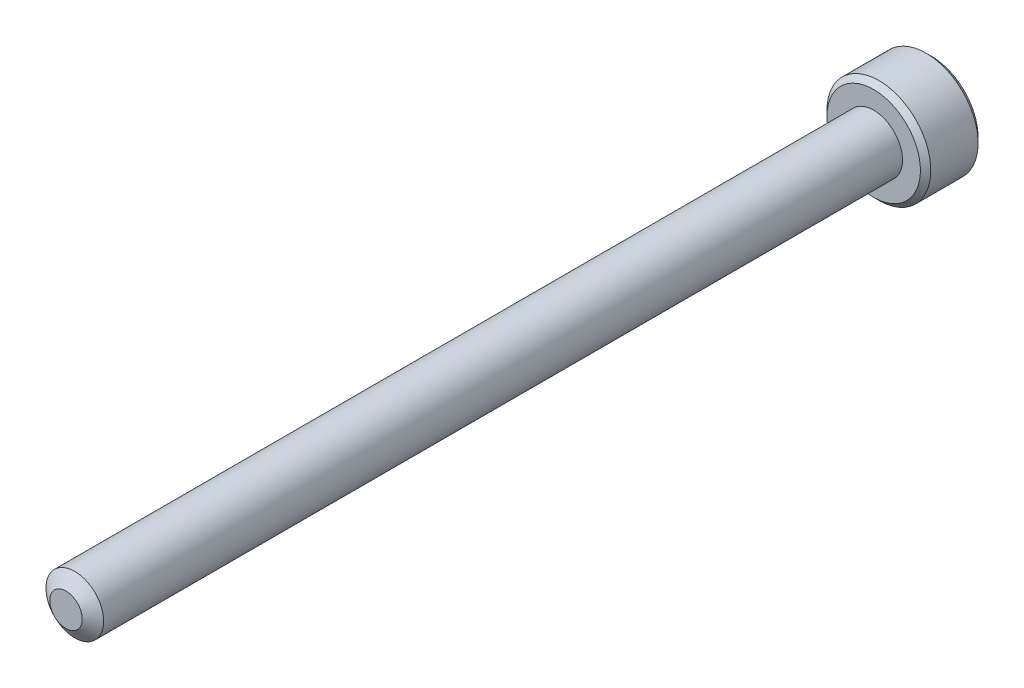
ISO-10303-21;
HEADER;
FILE_DESCRIPTION(('STEP AP214'),'2;1');
FILE_NAME('part.step','',(''),(''),'','','');
FILE_SCHEMA(('AUTOMOTIVE_DESIGN { 1 0 10303 214 1 1 1 1 }'));
ENDSEC;
DATA;
#1=APPLICATION_CONTEXT('core data for automotive mechanical design processes');
#2=APPLICATION_PROTOCOL_DEFINITION('international standard','automotive_design',2000,#1);
#3=PRODUCT_CONTEXT('',#1,'mechanical');
#4=PRODUCT('Part','Part','',(#3));
#5=PRODUCT_RELATED_PRODUCT_CATEGORY('part','',(#4));
#6=PRODUCT_DEFINITION_FORMATION('','',#4);
#7=PRODUCT_DEFINITION_CONTEXT('part definition',#1,'design');
#8=PRODUCT_DEFINITION('design','',#6,#7);
#9=PRODUCT_DEFINITION_SHAPE('','',#8);
#10=(LENGTH_UNIT() NAMED_UNIT(*) SI_UNIT(.MILLI.,.METRE.));
#11=(NAMED_UNIT(*) PLANE_ANGLE_UNIT() SI_UNIT($,.RADIAN.));
#12=(NAMED_UNIT(*) SI_UNIT($,.STERADIAN.) SOLID_ANGLE_UNIT());
#13=UNCERTAINTY_MEASURE_WITH_UNIT(LENGTH_MEASURE(1.E-05),#10,'distance_accuracy_value','');
#14=(GEOMETRIC_REPRESENTATION_CONTEXT(3) GLOBAL_UNCERTAINTY_ASSIGNED_CONTEXT((#13)) GLOBAL_UNIT_ASSIGNED_CONTEXT((#10,
#11,#12)) REPRESENTATION_CONTEXT('',''));
#15=CARTESIAN_POINT('',(0.,0.,0.));
#16=DIRECTION('',(0.,0.,1.));
#17=DIRECTION('',(1.,0.,0.));
#18=AXIS2_PLACEMENT_3D('',#15,#16,#17);
#19=CARTESIAN_POINT('',(0.,0.,-35.));
#20=DIRECTION('',(0.,0.,1.));
#21=DIRECTION('',(1.,0.,0.));
#22=AXIS2_PLACEMENT_3D('',#19,#20,#21);
#23=CYLINDRICAL_SURFACE('',#22,1.25);
#24=CARTESIAN_POINT('',(0.,0.,-35.));
#25=DIRECTION('',(0.,0.,-1.));
#26=DIRECTION('',(-1.,0.,0.));
#27=AXIS2_PLACEMENT_3D('',#24,#25,#26);
#28=CIRCLE('',#27,1.25);
#29=CARTESIAN_POINT('',(-1.25,0.,-35.));
#30=VERTEX_POINT('',#29);
#31=EDGE_CURVE('E220',#30,#30,#28,.F.);
#32=ORIENTED_EDGE('',*,*,#31,.T.);
#33=EDGE_LOOP('',(#32));
#34=FACE_BOUND('',#33,.T.);
#35=CARTESIAN_POINT('',(0.,0.,-0.382511876358969));
#36=DIRECTION('',(0.,0.,1.));
#37=DIRECTION('',(1.,0.,0.));
#38=AXIS2_PLACEMENT_3D('',#35,#36,#37);
#39=CIRCLE('',#38,1.25);
#40=CARTESIAN_POINT('',(1.25,0.,-0.382511876358969));
#41=VERTEX_POINT('',#40);
#42=EDGE_CURVE('E113',#41,#41,#39,.T.);
#43=ORIENTED_EDGE('',*,*,#42,.F.);
#44=EDGE_LOOP('',(#43));
#45=FACE_BOUND('',#44,.T.);
#46=ADVANCED_FACE('F39',(#34,#45),#23,.T.);
#47=CARTESIAN_POINT('',(0.,0.,0.));
#48=DIRECTION('',(0.,0.,-1.));
#49=DIRECTION('',(-1.,0.,0.));
#50=AXIS2_PLACEMENT_3D('',#47,#48,#49);
#51=CONICAL_SURFACE('',#50,0.70371642622275,0.959931088596884);
#52=ORIENTED_EDGE('',*,*,#42,.T.);
#53=EDGE_LOOP('',(#52));
#54=FACE_BOUND('',#53,.T.);
#55=CARTESIAN_POINT('',(0.,0.,0.));
#56=DIRECTION('',(0.,0.,1.));
#57=DIRECTION('',(1.,0.,0.));
#58=AXIS2_PLACEMENT_3D('',#55,#56,#57);
#59=CIRCLE('',#58,0.70371642622275);
#60=CARTESIAN_POINT('',(0.70371642622275,0.,0.));
#61=VERTEX_POINT('',#60);
#62=EDGE_CURVE('E218',#61,#61,#59,.T.);
#63=ORIENTED_EDGE('',*,*,#62,.F.);
#64=EDGE_LOOP('',(#63));
#65=FACE_BOUND('',#64,.T.);
#66=ADVANCED_FACE('F200',(#54,#65),#51,.T.);
#67=CARTESIAN_POINT('',(0.,0.,0.));
#68=DIRECTION('',(0.,0.,1.));
#69=DIRECTION('',(1.,0.,0.));
#70=AXIS2_PLACEMENT_3D('',#67,#68,#69);
#71=PLANE('',#70);
#72=ORIENTED_EDGE('',*,*,#62,.T.);
#73=EDGE_LOOP('',(#72));
#74=FACE_BOUND('',#73,.T.);
#75=ADVANCED_FACE('F197',(#74),#71,.T.);
#76=CARTESIAN_POINT('',(0.,0.,-37.5));
#77=DIRECTION('',(0.,0.,1.));
#78=DIRECTION('',(1.,0.,0.));
#79=AXIS2_PLACEMENT_3D('',#76,#77,#78);
#80=CYLINDRICAL_SURFACE('',#79,2.25);
#81=CARTESIAN_POINT('',(0.,0.,-37.275));
#82=DIRECTION('',(0.,0.,-1.));
#83=DIRECTION('',(-1.,0.,0.));
#84=AXIS2_PLACEMENT_3D('',#81,#82,#83);
#85=CIRCLE('',#84,2.25);
#86=CARTESIAN_POINT('',(-2.25,0.,-37.275));
#87=VERTEX_POINT('',#86);
#88=EDGE_CURVE('E47',#87,#87,#85,.F.);
#89=ORIENTED_EDGE('',*,*,#88,.T.);
#90=EDGE_LOOP('',(#89));
#91=FACE_BOUND('',#90,.T.);
#92=CARTESIAN_POINT('',(0.,0.,-35.225));
#93=DIRECTION('',(0.,0.,-1.));
#94=DIRECTION('',(-1.,0.,0.));
#95=AXIS2_PLACEMENT_3D('',#92,#93,#94);
#96=CIRCLE('',#95,2.25);
#97=CARTESIAN_POINT('',(-2.25,0.,-35.225));
#98=VERTEX_POINT('',#97);
#99=EDGE_CURVE('E176',#98,#98,#96,.T.);
#100=ORIENTED_EDGE('',*,*,#99,.T.);
#101=EDGE_LOOP('',(#100));
#102=FACE_BOUND('',#101,.T.);
#103=ADVANCED_FACE('F181',(#91,#102),#80,.T.);
#104=CARTESIAN_POINT('',(0.,0.,-37.5));
#105=DIRECTION('',(0.,0.,-1.));
#106=DIRECTION('',(-1.,0.,0.));
#107=AXIS2_PLACEMENT_3D('',#104,#105,#106);
#108=PLANE('',#107);
#109=CARTESIAN_POINT('',(0.,0.,-37.5));
#110=DIRECTION('',(0.,0.,-1.));
#111=DIRECTION('',(-1.,0.,0.));
#112=AXIS2_PLACEMENT_3D('',#109,#110,#111);
#113=CIRCLE('',#112,2.025);
#114=CARTESIAN_POINT('',(-2.025,0.,-37.5));
#115=VERTEX_POINT('',#114);
#116=EDGE_CURVE('E112',#115,#115,#113,.T.);
#117=ORIENTED_EDGE('',*,*,#116,.T.);
#118=EDGE_LOOP('',(#117));
#119=FACE_BOUND('',#118,.T.);
#120=CARTESIAN_POINT('',(0.,0.,-37.5));
#121=DIRECTION('',(0.,0.,-1.));
#122=DIRECTION('',(-1.,0.,0.));
#123=AXIS2_PLACEMENT_3D('',#120,#121,#122);
#124=CIRCLE('',#123,1.15470053837925);
#125=CARTESIAN_POINT('',(-0.999999999999999,0.577350269189627,-37.5));
#126=VERTEX_POINT('',#125);
#127=CARTESIAN_POINT('',(0.,1.15470053837925,-37.5));
#128=VERTEX_POINT('',#127);
#129=EDGE_CURVE('E93',#126,#128,#124,.T.);
#130=ORIENTED_EDGE('',*,*,#129,.F.);
#131=CARTESIAN_POINT('',(-1.,-0.577350269189626,-37.5));
#132=VERTEX_POINT('',#131);
#133=EDGE_CURVE('E53',#132,#126,#124,.T.);
#134=ORIENTED_EDGE('',*,*,#133,.F.);
#135=CARTESIAN_POINT('',(0.,-1.15470053837925,-37.5));
#136=VERTEX_POINT('',#135);
#137=EDGE_CURVE('E279',#136,#132,#124,.T.);
#138=ORIENTED_EDGE('',*,*,#137,.F.);
#139=CARTESIAN_POINT('',(1.,-0.577350269189627,-37.5));
#140=VERTEX_POINT('',#139);
#141=EDGE_CURVE('E60',#140,#136,#124,.T.);
#142=ORIENTED_EDGE('',*,*,#141,.F.);
#143=CARTESIAN_POINT('',(1.,0.577350269189626,-37.5));
#144=VERTEX_POINT('',#143);
#145=EDGE_CURVE('E134',#144,#140,#124,.T.);
#146=ORIENTED_EDGE('',*,*,#145,.F.);
#147=EDGE_CURVE('E102',#128,#144,#124,.T.);
#148=ORIENTED_EDGE('',*,*,#147,.F.);
#149=EDGE_LOOP('',(#130,#134,#138,#142,#146,#148));
#150=FACE_BOUND('',#149,.T.);
#151=ADVANCED_FACE('F133',(#119,#150),#108,.T.);
#152=CARTESIAN_POINT('',(0.,0.,-35.));
#153=DIRECTION('',(0.,0.,-1.));
#154=DIRECTION('',(-1.,0.,0.));
#155=AXIS2_PLACEMENT_3D('',#152,#153,#154);
#156=PLANE('',#155);
#157=CARTESIAN_POINT('',(0.,0.,-35.));
#158=DIRECTION('',(0.,0.,-1.));
#159=DIRECTION('',(-1.,0.,0.));
#160=AXIS2_PLACEMENT_3D('',#157,#158,#159);
#161=CIRCLE('',#160,2.025);
#162=CARTESIAN_POINT('',(-2.025,0.,-35.));
#163=VERTEX_POINT('',#162);
#164=EDGE_CURVE('E11',#163,#163,#161,.F.);
#165=ORIENTED_EDGE('',*,*,#164,.T.);
#166=EDGE_LOOP('',(#165));
#167=FACE_BOUND('',#166,.T.);
#168=ORIENTED_EDGE('',*,*,#31,.F.);
#169=EDGE_LOOP('',(#168));
#170=FACE_BOUND('',#169,.T.);
#171=ADVANCED_FACE('F190',(#167,#170),#156,.F.);
#172=CARTESIAN_POINT('',(0.,0.,-37.5));
#173=DIRECTION('',(0.,0.,-1.));
#174=DIRECTION('',(-1.,0.,0.));
#175=AXIS2_PLACEMENT_3D('',#172,#173,#174);
#176=CONICAL_SURFACE('',#175,1.15470053837925,0.78539816339745);
#177=ORIENTED_EDGE('',*,*,#147,.T.);
#178=CARTESIAN_POINT('',(-0.000200000000000379,1.15481600843309,-37.5001154873726));
#179=CARTESIAN_POINT('',(0.0341825950071801,1.13496520795026,-37.4802779308257));
#180=CARTESIAN_POINT('',(0.0691401181398246,1.11478247255942,-37.4616050206389));
#181=CARTESIAN_POINT('',(0.140422802956091,1.07362739529219,-37.4274147427232));
#182=CARTESIAN_POINT('',(0.176754750528987,1.0526511355808,-37.4119164090235));
#183=CARTESIAN_POINT('',(0.250016613803317,1.01035337909803,-37.3853673071423));
#184=CARTESIAN_POINT('',(0.286927851445421,0.989042666109237,-37.3742497739969));
#185=CARTESIAN_POINT('',(0.361562729310866,0.945952199282687,-37.3571198657762));
#186=CARTESIAN_POINT('',(0.399284088108643,0.924173762626593,-37.3510946974667));
#187=CARTESIAN_POINT('',(0.464292198417941,0.886641312640011,-37.3456605549675));
#188=CARTESIAN_POINT('',(0.491494371528179,0.870936130672271,-37.3448569383167));
#189=CARTESIAN_POINT('',(0.54584604066912,0.839556179862844,-37.3462066994169));
#190=CARTESIAN_POINT('',(0.572995523754883,0.823881418494919,-37.3483607295472));
#191=CARTESIAN_POINT('',(0.654056277326968,0.777080970599362,-37.3591169721285));
#192=CARTESIAN_POINT('',(0.707564140978436,0.746188191116425,-37.3720145564154));
#193=CARTESIAN_POINT('',(0.801476065143439,0.691968116419645,-37.4031407306022));
#194=CARTESIAN_POINT('',(0.84232052367184,0.668386557293369,-37.4197377977018));
#195=CARTESIAN_POINT('',(0.922409637381945,0.62214708593368,-37.4571249246853));
#196=CARTESIAN_POINT('',(0.961659010870438,0.599486449584575,-37.4779013418174));
#197=CARTESIAN_POINT('',(1.0002,0.577234799135788,-37.5001154873726));
#198=B_SPLINE_CURVE_WITH_KNOTS('',3,(#178,#179,#180,#181,#182,#183,#184,#185,#186,#187,#188,
#189,#190,#191,#192,#193,#194,#195,#196,#197),.UNSPECIFIED.,.F.,.F.,(4,2,2,2,2,2,2,2,2,4),(0.,
0.13323767682856,0.267252229834496,0.39913707626931,0.530689603280778,0.624814864263856,
0.718960890149144,0.907306626112109,1.0571010036179,1.20641411519286),.UNSPECIFIED.);
#199=EDGE_CURVE('E107',#128,#144,#198,.T.);
#200=ORIENTED_EDGE('',*,*,#199,.F.);
#201=EDGE_LOOP('',(#177,#200));
#202=FACE_BOUND('',#201,.T.);
#203=ADVANCED_FACE('F108',(#202),#176,.F.);
#204=ORIENTED_EDGE('',*,*,#145,.T.);
#205=CARTESIAN_POINT('',(1.,-1.15147208646462,-37.8703856775139));
#206=CARTESIAN_POINT('',(1.,-1.12343447988552,-37.8492199198737));
#207=CARTESIAN_POINT('',(1.,-1.09524064850697,-37.8282616921759));
#208=CARTESIAN_POINT('',(1.,-1.03847715644376,-37.7868460222356));
#209=CARTESIAN_POINT('',(1.,-1.00990740382975,-37.7663887061237));
#210=CARTESIAN_POINT('',(1.,-0.923120894333473,-37.7056047949545));
#211=CARTESIAN_POINT('',(1.,-0.864253173759057,-37.6661922289614));
#212=CARTESIAN_POINT('',(1.,-0.740809858258044,-37.5888206642002));
#213=CARTESIAN_POINT('',(1.,-0.676100255137806,-37.5510730391143));
#214=CARTESIAN_POINT('',(1.,-0.543448939049123,-37.4820245875513));
#215=CARTESIAN_POINT('',(1.,-0.475519112027777,-37.4507020278469));
#216=CARTESIAN_POINT('',(1.,-0.373555850333527,-37.4123817788838));
#217=CARTESIAN_POINT('',(1.,-0.341031989670906,-37.4013835916422));
#218=CARTESIAN_POINT('',(1.,-0.275199079052292,-37.3819983421474));
#219=CARTESIAN_POINT('',(1.,-0.241889975173932,-37.3736114597767));
#220=CARTESIAN_POINT('',(1.,-0.175247517042993,-37.360025220719));
#221=CARTESIAN_POINT('',(1.,-0.141925568218175,-37.354770790768));
#222=CARTESIAN_POINT('',(1.,-0.0749144362322789,-37.3475486865709));
#223=CARTESIAN_POINT('',(1.,-0.0412251978501619,-37.3455815136105));
#224=CARTESIAN_POINT('',(1.,0.0249580992634206,-37.3450831983932));
#225=CARTESIAN_POINT('',(1.,0.0574512826460388,-37.3464302678886));
#226=CARTESIAN_POINT('',(1.,0.122148505701866,-37.352216484499));
#227=CARTESIAN_POINT('',(1.,0.154352610132926,-37.3566549206615));
#228=CARTESIAN_POINT('',(1.,0.218799898867638,-37.3684568301452));
#229=CARTESIAN_POINT('',(1.,0.251033743268951,-37.3758705410385));
#230=CARTESIAN_POINT('',(1.,0.314797132354916,-37.3932289424987));
#231=CARTESIAN_POINT('',(1.,0.346326735731002,-37.4031734212888));
#232=CARTESIAN_POINT('',(1.,0.445594187730202,-37.4382234825543));
#233=CARTESIAN_POINT('',(1.,0.511919139476034,-37.4673208583567));
#234=CARTESIAN_POINT('',(1.,0.641453244657528,-37.5320153296865));
#235=CARTESIAN_POINT('',(1.,0.704650133126339,-37.5676357767152));
#236=CARTESIAN_POINT('',(1.,0.825428490174982,-37.6411239013469));
#237=CARTESIAN_POINT('',(1.,0.883132947867683,-37.6787919471355));
#238=CARTESIAN_POINT('',(1.,0.968148853704564,-37.7370228529432));
#239=CARTESIAN_POINT('',(1.,0.996120570380283,-37.7566384757629));
#240=CARTESIAN_POINT('',(1.,1.05168177729901,-37.7963885170613));
#241=CARTESIAN_POINT('',(1.,1.079271369977,-37.8165227921988));
#242=CARTESIAN_POINT('',(1.,1.10670185346329,-37.836872119073));
#243=B_SPLINE_CURVE_WITH_KNOTS('',3,(#205,#206,#207,#208,#209,#210,#211,#212,#213,#214,#215,
#216,#217,#218,#219,#220,#221,#222,#223,#224,#225,#226,#227,#228,#229,#230,#231,#232,#233,#234,
#235,#236,#237,#238,#239,#240,#241,#242),.UNSPECIFIED.,.F.,.F.,(4,2,2,2,2,2,2,2,2,2,2,2,2,2,2,2,
2,2,4),(0.,0.105386459083292,0.210799187330128,0.423233611565469,0.647793540908501,
0.871580877738609,0.974493074181419,1.07741235827201,1.17846428203204,1.27953161415762,
1.3769408673961,1.47432772585407,1.57343322804293,1.67253043972851,1.88917353996826,
2.10660791038812,2.31323734249843,2.41572589232044,2.51818641476502),.UNSPECIFIED.);
#244=EDGE_CURVE('E101',#144,#140,#243,.F.);
#245=ORIENTED_EDGE('',*,*,#244,.F.);
#246=EDGE_LOOP('',(#204,#245));
#247=FACE_BOUND('',#246,.T.);
#248=ADVANCED_FACE('F285',(#247),#176,.F.);
#249=ORIENTED_EDGE('',*,*,#141,.T.);
#250=CARTESIAN_POINT('',(1.0002,-0.577234799135788,-37.5001154873726));
#251=CARTESIAN_POINT('',(0.965817404992821,-0.597085599618621,-37.4802779308257));
#252=CARTESIAN_POINT('',(0.930859881860177,-0.617268335009455,-37.4616050206389));
#253=CARTESIAN_POINT('',(0.859577197043914,-0.658423412276684,-37.4274147427232));
#254=CARTESIAN_POINT('',(0.82324524947102,-0.679399671988078,-37.4119164090235));
#255=CARTESIAN_POINT('',(0.749983386196693,-0.721697428470844,-37.3853673071423));
#256=CARTESIAN_POINT('',(0.713072148554591,-0.743008141459634,-37.3742497739969));
#257=CARTESIAN_POINT('',(0.638437270689147,-0.786098608286183,-37.3571198657762));
#258=CARTESIAN_POINT('',(0.60071591189137,-0.807877044942277,-37.3510946974667));
#259=CARTESIAN_POINT('',(0.535707801582073,-0.845409494928859,-37.3456605549675));
#260=CARTESIAN_POINT('',(0.508505628471835,-0.861114676896598,-37.3448569383167));
#261=CARTESIAN_POINT('',(0.454153959330895,-0.892494627706025,-37.3462066994169));
#262=CARTESIAN_POINT('',(0.427004476245131,-0.90816938907395,-37.3483607295472));
#263=CARTESIAN_POINT('',(0.345943722673047,-0.954969836969507,-37.3591169721285));
#264=CARTESIAN_POINT('',(0.29243585902158,-0.985862616452443,-37.3720145564154));
#265=CARTESIAN_POINT('',(0.198523934856574,-1.04008269114922,-37.4031407306022));
#266=CARTESIAN_POINT('',(0.157679476328169,-1.0636642502755,-37.4197377977018));
#267=CARTESIAN_POINT('',(0.0775903626180566,-1.1099037216352,-37.4571249246853));
#268=CARTESIAN_POINT('',(0.0383409891295611,-1.1325643579843,-37.4779013418174));
#269=CARTESIAN_POINT('',(-0.000200000000001363,-1.15481600843309,-37.5001154873726));
#270=B_SPLINE_CURVE_WITH_KNOTS('',3,(#250,#251,#252,#253,#254,#255,#256,#257,#258,#259,#260,
#261,#262,#263,#264,#265,#266,#267,#268,#269),.UNSPECIFIED.,.F.,.F.,(4,2,2,2,2,2,2,2,2,4),(0.,
0.133237676828557,0.267252229834487,0.399137076269294,0.530689603280762,0.624814864263839,
0.718960890149125,0.90730662611209,1.05710100361789,1.20641411519286),.UNSPECIFIED.);
#271=EDGE_CURVE('E144',#140,#136,#270,.T.);
#272=ORIENTED_EDGE('',*,*,#271,.F.);
#273=EDGE_LOOP('',(#249,#272));
#274=FACE_BOUND('',#273,.T.);
#275=ADVANCED_FACE('F282',(#274),#176,.F.);
#276=ORIENTED_EDGE('',*,*,#137,.T.);
#277=CARTESIAN_POINT('',(0.00020000000000106,-1.15481600843309,-37.5001154873726));
#278=CARTESIAN_POINT('',(-0.0341825950071787,-1.13496520795026,-37.4802779308257));
#279=CARTESIAN_POINT('',(-0.069140118139822,-1.11478247255942,-37.4616050206389));
#280=CARTESIAN_POINT('',(-0.140422802956086,-1.07362739529219,-37.4274147427232));
#281=CARTESIAN_POINT('',(-0.17675475052898,-1.0526511355808,-37.4119164090235));
#282=CARTESIAN_POINT('',(-0.250016613803306,-1.01035337909803,-37.3853673071423));
#283=CARTESIAN_POINT('',(-0.286927851445409,-0.989042666109244,-37.3742497739969));
#284=CARTESIAN_POINT('',(-0.361562729310853,-0.945952199282695,-37.3571198657762));
#285=CARTESIAN_POINT('',(-0.399284088108629,-0.9241737626266,-37.3510946974667));
#286=CARTESIAN_POINT('',(-0.464292198417926,-0.886641312640019,-37.3456605549675));
#287=CARTESIAN_POINT('',(-0.491494371528165,-0.87093613067228,-37.3448569383167));
#288=CARTESIAN_POINT('',(-0.545846040669104,-0.839556179862853,-37.3462066994169));
#289=CARTESIAN_POINT('',(-0.572995523754868,-0.823881418494928,-37.3483607295472));
#290=CARTESIAN_POINT('',(-0.654056277326953,-0.777080970599371,-37.3591169721285));
#291=CARTESIAN_POINT('',(-0.707564140978419,-0.746188191116435,-37.3720145564154));
#292=CARTESIAN_POINT('',(-0.801476065143425,-0.691968116419653,-37.4031407306022));
#293=CARTESIAN_POINT('',(-0.84232052367183,-0.668386557293374,-37.4197377977018));
#294=CARTESIAN_POINT('',(-0.922409637381943,-0.622147085933682,-37.4571249246853));
#295=CARTESIAN_POINT('',(-0.961659010870439,-0.599486449584574,-37.4779013418174));
#296=CARTESIAN_POINT('',(-1.0002,-0.577234799135787,-37.5001154873726));
#297=B_SPLINE_CURVE_WITH_KNOTS('',3,(#277,#278,#279,#280,#281,#282,#283,#284,#285,#286,#287,
#288,#289,#290,#291,#292,#293,#294,#295,#296),.UNSPECIFIED.,.F.,.F.,(4,2,2,2,2,2,2,2,2,4),(0.,
0.133237676828557,0.267252229834487,0.399137076269294,0.530689603280761,0.624814864263839,
0.718960890149125,0.90730662611209,1.05710100361789,1.20641411519287),.UNSPECIFIED.);
#298=EDGE_CURVE('E256',#136,#132,#297,.T.);
#299=ORIENTED_EDGE('',*,*,#298,.F.);
#300=EDGE_LOOP('',(#276,#299));
#301=FACE_BOUND('',#300,.T.);
#302=ADVANCED_FACE('F281',(#301),#176,.F.);
#303=ORIENTED_EDGE('',*,*,#133,.T.);
#304=CARTESIAN_POINT('',(-1.,-1.15147208663215,-37.8703856776404));
#305=CARTESIAN_POINT('',(-1.,-1.12343448004836,-37.8492199199953));
#306=CARTESIAN_POINT('',(-1.,-1.09524064866509,-37.8282616922927));
#307=CARTESIAN_POINT('',(-1.,-1.03847715659241,-37.7868460223427));
#308=CARTESIAN_POINT('',(-1.,-1.00990740397363,-37.7663887062259));
#309=CARTESIAN_POINT('',(-1.,-0.923120894462779,-37.7056047950421));
#310=CARTESIAN_POINT('',(-1.,-0.864253173878447,-37.6661922290393));
#311=CARTESIAN_POINT('',(-1.,-0.740809858355813,-37.5888206642582));
#312=CARTESIAN_POINT('',(-1.,-0.676100255223812,-37.5510730391622));
#313=CARTESIAN_POINT('',(-1.,-0.543448939110601,-37.4820245875803));
#314=CARTESIAN_POINT('',(-1.,-0.475519112076498,-37.4507020278671));
#315=CARTESIAN_POINT('',(-1.,-0.373555850372651,-37.4123817788976));
#316=CARTESIAN_POINT('',(-1.,-0.34103198971405,-37.4013835916562));
#317=CARTESIAN_POINT('',(-1.,-0.275199079103606,-37.3819983421611));
#318=CARTESIAN_POINT('',(-0.999999999999999,-0.241889975229396,-37.3736114597899));
#319=CARTESIAN_POINT('',(-0.999999999999999,-0.175247517106618,-37.3600252207302));
#320=CARTESIAN_POINT('',(-0.999999999999999,-0.141925568285811,-37.3547707907776));
#321=CARTESIAN_POINT('',(-0.999999999999999,-0.0749144363078044,-37.3475486865767));
#322=CARTESIAN_POINT('',(-0.999999999999999,-0.0412251979295659,-37.3455815136139));
#323=CARTESIAN_POINT('',(-0.999999999999999,0.0249580991768617,-37.3450831983911));
#324=CARTESIAN_POINT('',(-0.999999999999999,0.0574512825561936,-37.3464302678836));
#325=CARTESIAN_POINT('',(-0.999999999999999,0.122148505605777,-37.3522164844874));
#326=CARTESIAN_POINT('',(-0.999999999999999,0.154352610033879,-37.3566549206465));
#327=CARTESIAN_POINT('',(-0.999999999999999,0.218799898762754,-37.3684568301229));
#328=CARTESIAN_POINT('',(-0.999999999999999,0.251033743161195,-37.3758705410123));
#329=CARTESIAN_POINT('',(-0.999999999999999,0.314797132241693,-37.3932289424647));
#330=CARTESIAN_POINT('',(-0.999999999999999,0.346326735615183,-37.4031734212509));
#331=CARTESIAN_POINT('',(-0.999999999999999,0.445594187589163,-37.4382234824979));
#332=CARTESIAN_POINT('',(-0.999999999999999,0.511919139313634,-37.4673208582833));
#333=CARTESIAN_POINT('',(-0.999999999999999,0.641453244454048,-37.5320153295771));
#334=CARTESIAN_POINT('',(-0.999999999999999,0.70465013290315,-37.567635776587));
#335=CARTESIAN_POINT('',(-0.999999999999999,0.825428489916354,-37.6411239011825));
#336=CARTESIAN_POINT('',(-0.999999999999999,0.883132947593197,-37.6787919469539));
#337=CARTESIAN_POINT('',(-0.999999999999999,0.968148853406641,-37.737022852736));
#338=CARTESIAN_POINT('',(-0.999999999999999,0.996120570074662,-37.7566384755472));
#339=CARTESIAN_POINT('',(-0.999999999999999,1.05168177697804,-37.7963885168287));
#340=CARTESIAN_POINT('',(-0.999999999999999,1.07927136964838,-37.8165227919578));
#341=CARTESIAN_POINT('',(-0.999999999999999,1.10670185312703,-37.8368721188235));
#342=B_SPLINE_CURVE_WITH_KNOTS('',3,(#304,#305,#306,#307,#308,#309,#310,#311,#312,#313,#314,
#315,#316,#317,#318,#319,#320,#321,#322,#323,#324,#325,#326,#327,#328,#329,#330,#331,#332,#333,
#334,#335,#336,#337,#338,#339,#340,#341),.UNSPECIFIED.,.F.,.F.,(4,2,2,2,2,2,2,2,2,2,2,2,2,2,2,2,
2,2,4),(0.,0.105386459103347,0.21079918737025,0.423233611646474,0.647793541035353,
0.871580877910865,0.974493074342054,1.07741235842104,1.17846428216995,1.2795316142844,
1.37694086751269,1.47432772596047,1.57343322813835,1.67253043981296,1.88917353997386,
2.10660791031434,2.31323734235672,2.41572589214524,2.51818641455633),.UNSPECIFIED.);
#343=EDGE_CURVE('E123',#132,#126,#342,.T.);
#344=ORIENTED_EDGE('',*,*,#343,.F.);
#345=EDGE_LOOP('',(#303,#344));
#346=FACE_BOUND('',#345,.T.);
#347=ADVANCED_FACE('F294',(#346),#176,.F.);
#348=ORIENTED_EDGE('',*,*,#129,.T.);
#349=CARTESIAN_POINT('',(-1.0002,0.577234799135788,-37.5001154873726));
#350=CARTESIAN_POINT('',(-0.96581740499282,0.597085599618621,-37.4802779308257));
#351=CARTESIAN_POINT('',(-0.930859881860177,0.617268335009455,-37.4616050206389));
#352=CARTESIAN_POINT('',(-0.859577197043914,0.658423412276684,-37.4274147427232));
#353=CARTESIAN_POINT('',(-0.823245249471019,0.679399671988078,-37.4119164090235));
#354=CARTESIAN_POINT('',(-0.749983386196693,0.721697428470844,-37.3853673071423));
#355=CARTESIAN_POINT('',(-0.713072148554591,0.743008141459634,-37.3742497739969));
#356=CARTESIAN_POINT('',(-0.638437270689147,0.786098608286183,-37.3571198657762));
#357=CARTESIAN_POINT('',(-0.60071591189137,0.807877044942277,-37.3510946974667));
#358=CARTESIAN_POINT('',(-0.535707801582073,0.845409494928859,-37.3456605549675));
#359=CARTESIAN_POINT('',(-0.508505628471834,0.861114676896598,-37.3448569383167));
#360=CARTESIAN_POINT('',(-0.454153959330895,0.892494627706025,-37.3462066994169));
#361=CARTESIAN_POINT('',(-0.427004476245131,0.90816938907395,-37.3483607295472));
#362=CARTESIAN_POINT('',(-0.345943722673047,0.954969836969507,-37.3591169721285));
#363=CARTESIAN_POINT('',(-0.29243585902158,0.985862616452443,-37.3720145564154));
#364=CARTESIAN_POINT('',(-0.198523934856574,1.04008269114922,-37.4031407306022));
#365=CARTESIAN_POINT('',(-0.157679476328169,1.0636642502755,-37.4197377977018));
#366=CARTESIAN_POINT('',(-0.0775903626180559,1.1099037216352,-37.4571249246853));
#367=CARTESIAN_POINT('',(-0.0383409891295604,1.1325643579843,-37.4779013418174));
#368=CARTESIAN_POINT('',(0.000200000000002069,1.15481600843309,-37.5001154873726));
#369=B_SPLINE_CURVE_WITH_KNOTS('',3,(#349,#350,#351,#352,#353,#354,#355,#356,#357,#358,#359,
#360,#361,#362,#363,#364,#365,#366,#367,#368),.UNSPECIFIED.,.F.,.F.,(4,2,2,2,2,2,2,2,2,4),(0.,
0.133237676828557,0.267252229834487,0.399137076269294,0.530689603280761,0.624814864263839,
0.718960890149125,0.90730662611209,1.05710100361789,1.20641411519286),.UNSPECIFIED.);
#370=EDGE_CURVE('E97',#126,#128,#369,.T.);
#371=ORIENTED_EDGE('',*,*,#370,.F.);
#372=EDGE_LOOP('',(#348,#371));
#373=FACE_BOUND('',#372,.T.);
#374=ADVANCED_FACE('F95',(#373),#176,.F.);
#375=CARTESIAN_POINT('',(1.,1.73205080756888,-36.));
#376=DIRECTION('',(0.,0.,-1.));
#377=DIRECTION('',(-1.,0.,0.));
#378=AXIS2_PLACEMENT_3D('',#375,#376,#377);
#379=PLANE('',#378);
#380=DIRECTION('',(0.866025403784439,0.5,0.));
#381=VECTOR('',#380,1.);
#382=CARTESIAN_POINT('',(-0.999999999999999,0.577350269189626,-36.));
#383=LINE('',#382,#381);
#384=CARTESIAN_POINT('',(-0.999999999999999,0.577350269189626,-36.));
#385=VERTEX_POINT('',#384);
#386=CARTESIAN_POINT('',(0.,1.15470053837925,-36.));
#387=VERTEX_POINT('',#386);
#388=EDGE_CURVE('E122',#385,#387,#383,.T.);
#389=ORIENTED_EDGE('',*,*,#388,.T.);
#390=DIRECTION('',(0.866025403784439,-0.5,0.));
#391=VECTOR('',#390,1.);
#392=CARTESIAN_POINT('',(0.,1.15470053837925,-36.));
#393=LINE('',#392,#391);
#394=CARTESIAN_POINT('',(1.,0.577350269189626,-36.));
#395=VERTEX_POINT('',#394);
#396=EDGE_CURVE('E127',#387,#395,#393,.T.);
#397=ORIENTED_EDGE('',*,*,#396,.T.);
#398=DIRECTION('',(0.,-1.,0.));
#399=VECTOR('',#398,1.);
#400=CARTESIAN_POINT('',(1.,0.577350269189626,-36.));
#401=LINE('',#400,#399);
#402=CARTESIAN_POINT('',(1.,-0.577350269189626,-36.));
#403=VERTEX_POINT('',#402);
#404=EDGE_CURVE('E242',#395,#403,#401,.T.);
#405=ORIENTED_EDGE('',*,*,#404,.T.);
#406=DIRECTION('',(-0.866025403784439,-0.5,0.));
#407=VECTOR('',#406,1.);
#408=CARTESIAN_POINT('',(1.,-0.577350269189626,-36.));
#409=LINE('',#408,#407);
#410=CARTESIAN_POINT('',(0.,-1.15470053837925,-36.));
#411=VERTEX_POINT('',#410);
#412=EDGE_CURVE('E239',#403,#411,#409,.T.);
#413=ORIENTED_EDGE('',*,*,#412,.T.);
#414=DIRECTION('',(-0.866025403784439,0.5,0.));
#415=VECTOR('',#414,1.);
#416=CARTESIAN_POINT('',(0.,-1.15470053837925,-36.));
#417=LINE('',#416,#415);
#418=CARTESIAN_POINT('',(-1.,-0.577350269189626,-36.));
#419=VERTEX_POINT('',#418);
#420=EDGE_CURVE('E236',#411,#419,#417,.T.);
#421=ORIENTED_EDGE('',*,*,#420,.T.);
#422=DIRECTION('',(0.,1.,0.));
#423=VECTOR('',#422,1.);
#424=CARTESIAN_POINT('',(-1.,-0.577350269189626,-36.));
#425=LINE('',#424,#423);
#426=EDGE_CURVE('E130',#419,#385,#425,.T.);
#427=ORIENTED_EDGE('',*,*,#426,.T.);
#428=EDGE_LOOP('',(#389,#397,#405,#413,#421,#427));
#429=FACE_BOUND('',#428,.T.);
#430=ADVANCED_FACE('F164',(#429),#379,.T.);
#431=CARTESIAN_POINT('',(0.,1.15470053837925,-36.));
#432=DIRECTION('',(0.5,0.866025403784438,0.));
#433=DIRECTION('',(-0.866025403784439,0.5,0.));
#434=AXIS2_PLACEMENT_3D('',#431,#432,#433);
#435=PLANE('',#434);
#436=DIRECTION('',(0.,0.,-1.));
#437=VECTOR('',#436,1.);
#438=CARTESIAN_POINT('',(0.,1.15470053837925,-36.));
#439=LINE('',#438,#437);
#440=EDGE_CURVE('E119',#387,#128,#439,.T.);
#441=ORIENTED_EDGE('',*,*,#440,.T.);
#442=ORIENTED_EDGE('',*,*,#199,.T.);
#443=DIRECTION('',(0.,0.,-1.));
#444=VECTOR('',#443,1.);
#445=CARTESIAN_POINT('',(1.,0.577350269189626,-36.));
#446=LINE('',#445,#444);
#447=EDGE_CURVE('E129',#395,#144,#446,.T.);
#448=ORIENTED_EDGE('',*,*,#447,.F.);
#449=ORIENTED_EDGE('',*,*,#396,.F.);
#450=EDGE_LOOP('',(#441,#442,#448,#449));
#451=FACE_BOUND('',#450,.T.);
#452=ADVANCED_FACE('F125',(#451),#435,.F.);
#453=CARTESIAN_POINT('',(1.,0.577350269189626,-36.));
#454=DIRECTION('',(1.,0.,0.));
#455=DIRECTION('',(0.,0.,-1.));
#456=AXIS2_PLACEMENT_3D('',#453,#454,#455);
#457=PLANE('',#456);
#458=ORIENTED_EDGE('',*,*,#447,.T.);
#459=ORIENTED_EDGE('',*,*,#244,.T.);
#460=DIRECTION('',(0.,0.,-1.));
#461=VECTOR('',#460,1.);
#462=CARTESIAN_POINT('',(1.,-0.577350269189626,-36.));
#463=LINE('',#462,#461);
#464=EDGE_CURVE('E225',#403,#140,#463,.T.);
#465=ORIENTED_EDGE('',*,*,#464,.F.);
#466=ORIENTED_EDGE('',*,*,#404,.F.);
#467=EDGE_LOOP('',(#458,#459,#465,#466));
#468=FACE_BOUND('',#467,.T.);
#469=ADVANCED_FACE('F153',(#468),#457,.F.);
#470=CARTESIAN_POINT('',(1.,-0.577350269189626,-36.));
#471=DIRECTION('',(0.5,-0.866025403784439,0.));
#472=DIRECTION('',(0.866025403784439,0.5,0.));
#473=AXIS2_PLACEMENT_3D('',#470,#471,#472);
#474=PLANE('',#473);
#475=ORIENTED_EDGE('',*,*,#464,.T.);
#476=ORIENTED_EDGE('',*,*,#271,.T.);
#477=DIRECTION('',(0.,0.,-1.));
#478=VECTOR('',#477,1.);
#479=CARTESIAN_POINT('',(0.,-1.15470053837925,-36.));
#480=LINE('',#479,#478);
#481=EDGE_CURVE('E228',#411,#136,#480,.T.);
#482=ORIENTED_EDGE('',*,*,#481,.F.);
#483=ORIENTED_EDGE('',*,*,#412,.F.);
#484=EDGE_LOOP('',(#475,#476,#482,#483));
#485=FACE_BOUND('',#484,.T.);
#486=ADVANCED_FACE('F157',(#485),#474,.F.);
#487=CARTESIAN_POINT('',(0.,-1.15470053837925,-36.));
#488=DIRECTION('',(-0.5,-0.866025403784439,0.));
#489=DIRECTION('',(0.866025403784439,-0.5,0.));
#490=AXIS2_PLACEMENT_3D('',#487,#488,#489);
#491=PLANE('',#490);
#492=ORIENTED_EDGE('',*,*,#481,.T.);
#493=ORIENTED_EDGE('',*,*,#298,.T.);
#494=DIRECTION('',(0.,0.,-1.));
#495=VECTOR('',#494,1.);
#496=CARTESIAN_POINT('',(-1.,-0.577350269189626,-36.));
#497=LINE('',#496,#495);
#498=EDGE_CURVE('E231',#419,#132,#497,.T.);
#499=ORIENTED_EDGE('',*,*,#498,.F.);
#500=ORIENTED_EDGE('',*,*,#420,.F.);
#501=EDGE_LOOP('',(#492,#493,#499,#500));
#502=FACE_BOUND('',#501,.T.);
#503=ADVANCED_FACE('F264',(#502),#491,.F.);
#504=CARTESIAN_POINT('',(-1.,-0.577350269189626,-36.));
#505=DIRECTION('',(-1.,0.,0.));
#506=DIRECTION('',(0.,-1.,0.));
#507=AXIS2_PLACEMENT_3D('',#504,#505,#506);
#508=PLANE('',#507);
#509=ORIENTED_EDGE('',*,*,#498,.T.);
#510=ORIENTED_EDGE('',*,*,#343,.T.);
#511=DIRECTION('',(0.,0.,-1.));
#512=VECTOR('',#511,1.);
#513=CARTESIAN_POINT('',(-0.999999999999999,0.577350269189626,-36.));
#514=LINE('',#513,#512);
#515=EDGE_CURVE('E121',#385,#126,#514,.T.);
#516=ORIENTED_EDGE('',*,*,#515,.F.);
#517=ORIENTED_EDGE('',*,*,#426,.F.);
#518=EDGE_LOOP('',(#509,#510,#516,#517));
#519=FACE_BOUND('',#518,.T.);
#520=ADVANCED_FACE('F261',(#519),#508,.F.);
#521=CARTESIAN_POINT('',(-0.999999999999999,0.577350269189626,-36.));
#522=DIRECTION('',(-0.5,0.866025403784439,0.));
#523=DIRECTION('',(-0.866025403784439,-0.5,0.));
#524=AXIS2_PLACEMENT_3D('',#521,#522,#523);
#525=PLANE('',#524);
#526=ORIENTED_EDGE('',*,*,#515,.T.);
#527=ORIENTED_EDGE('',*,*,#370,.T.);
#528=ORIENTED_EDGE('',*,*,#440,.F.);
#529=ORIENTED_EDGE('',*,*,#388,.F.);
#530=EDGE_LOOP('',(#526,#527,#528,#529));
#531=FACE_BOUND('',#530,.T.);
#532=ADVANCED_FACE('F117',(#531),#525,.F.);
#533=CARTESIAN_POINT('',(0.,0.,-37.5));
#534=DIRECTION('',(0.,0.,1.));
#535=DIRECTION('',(1.,0.,0.));
#536=AXIS2_PLACEMENT_3D('',#533,#534,#535);
#537=CONICAL_SURFACE('',#536,2.025,0.785398163397436);
#538=ORIENTED_EDGE('',*,*,#88,.F.);
#539=EDGE_LOOP('',(#538));
#540=FACE_BOUND('',#539,.T.);
#541=ORIENTED_EDGE('',*,*,#116,.F.);
#542=EDGE_LOOP('',(#541));
#543=FACE_BOUND('',#542,.T.);
#544=ADVANCED_FACE('F184',(#540,#543),#537,.T.);
#545=CARTESIAN_POINT('',(0.,0.,-35.225));
#546=DIRECTION('',(0.,0.,-1.));
#547=DIRECTION('',(-1.,0.,0.));
#548=AXIS2_PLACEMENT_3D('',#545,#546,#547);
#549=CONICAL_SURFACE('',#548,2.25,0.785398163397436);
#550=ORIENTED_EDGE('',*,*,#164,.F.);
#551=EDGE_LOOP('',(#550));
#552=FACE_BOUND('',#551,.T.);
#553=ORIENTED_EDGE('',*,*,#99,.F.);
#554=EDGE_LOOP('',(#553));
#555=FACE_BOUND('',#554,.T.);
#556=ADVANCED_FACE('F41',(#552,#555),#549,.T.);
#557=CLOSED_SHELL('',(#46,#66,#75,#103,#151,#171,#203,#248,#275,#302,#347,#374,#430,#452,#469,
#486,#503,#520,#532,#544,#556));
#558=MANIFOLD_SOLID_BREP('B2',#557);
#559=ADVANCED_BREP_SHAPE_REPRESENTATION('',(#18,#558),#14);
#560=SHAPE_DEFINITION_REPRESENTATION(#9,#559);
ENDSEC;
END-ISO-10303-21;
